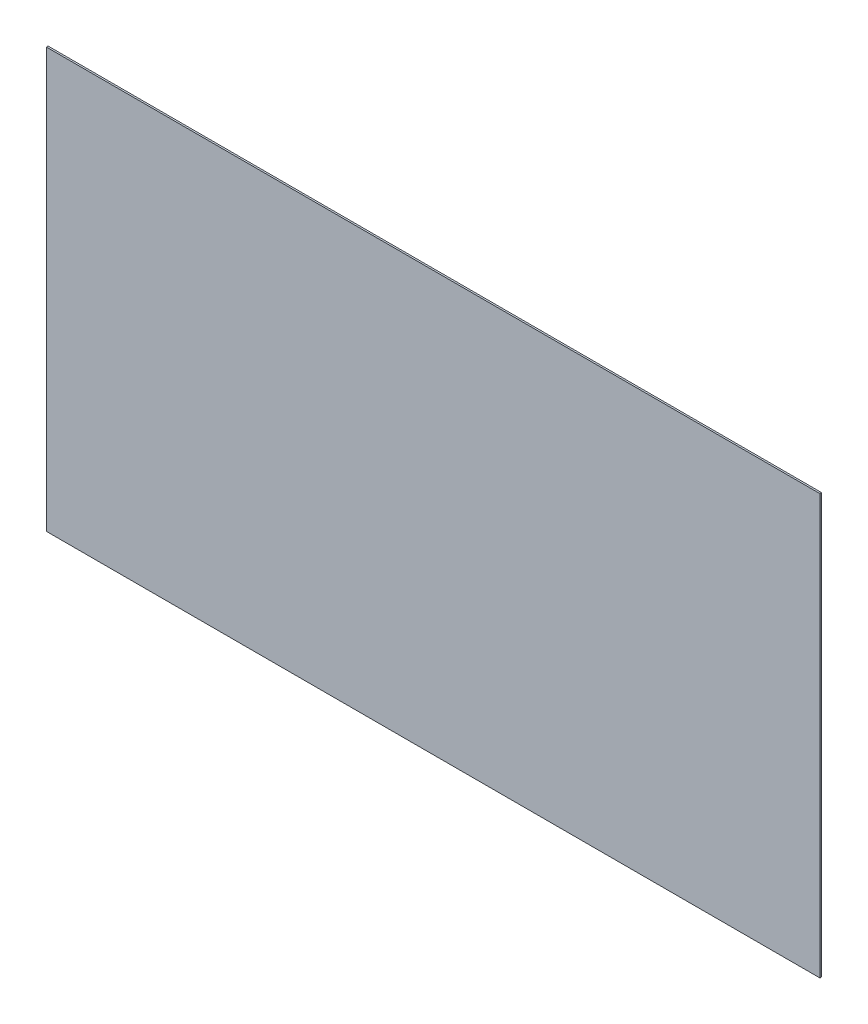
ISO-10303-21;
HEADER;
FILE_DESCRIPTION(('STEP AP214'),'2;1');
FILE_NAME('part.step','',(''),(''),'','','');
FILE_SCHEMA(('AUTOMOTIVE_DESIGN { 1 0 10303 214 1 1 1 1 }'));
ENDSEC;
DATA;
#1=APPLICATION_CONTEXT('core data for automotive mechanical design processes');
#2=APPLICATION_PROTOCOL_DEFINITION('international standard','automotive_design',2000,#1);
#3=PRODUCT_CONTEXT('',#1,'mechanical');
#4=PRODUCT('Part','Part','',(#3));
#5=PRODUCT_RELATED_PRODUCT_CATEGORY('part','',(#4));
#6=PRODUCT_DEFINITION_FORMATION('','',#4);
#7=PRODUCT_DEFINITION_CONTEXT('part definition',#1,'design');
#8=PRODUCT_DEFINITION('design','',#6,#7);
#9=PRODUCT_DEFINITION_SHAPE('','',#8);
#10=(LENGTH_UNIT() NAMED_UNIT(*) SI_UNIT(.MILLI.,.METRE.));
#11=(NAMED_UNIT(*) PLANE_ANGLE_UNIT() SI_UNIT($,.RADIAN.));
#12=(NAMED_UNIT(*) SI_UNIT($,.STERADIAN.) SOLID_ANGLE_UNIT());
#13=UNCERTAINTY_MEASURE_WITH_UNIT(LENGTH_MEASURE(1.E-05),#10,'distance_accuracy_value','');
#14=(GEOMETRIC_REPRESENTATION_CONTEXT(3) GLOBAL_UNCERTAINTY_ASSIGNED_CONTEXT((#13)) GLOBAL_UNIT_ASSIGNED_CONTEXT((#10,
#11,#12)) REPRESENTATION_CONTEXT('',''));
#15=CARTESIAN_POINT('',(0.,0.,0.));
#16=DIRECTION('',(0.,0.,1.));
#17=DIRECTION('',(1.,0.,0.));
#18=AXIS2_PLACEMENT_3D('',#15,#16,#17);
#19=CARTESIAN_POINT('',(225.,122.,1.));
#20=DIRECTION('',(-1.,0.,0.));
#21=DIRECTION('',(0.,-1.,0.));
#22=AXIS2_PLACEMENT_3D('',#19,#20,#21);
#23=PLANE('',#22);
#24=DIRECTION('',(0.,1.,0.));
#25=VECTOR('',#24,1.);
#26=CARTESIAN_POINT('',(225.,122.,0.));
#27=LINE('',#26,#25);
#28=CARTESIAN_POINT('',(225.,-122.,0.));
#29=VERTEX_POINT('',#28);
#30=CARTESIAN_POINT('',(225.,122.,0.));
#31=VERTEX_POINT('',#30);
#32=EDGE_CURVE('E113',#29,#31,#27,.T.);
#33=ORIENTED_EDGE('',*,*,#32,.T.);
#34=DIRECTION('',(0.,0.,-1.));
#35=VECTOR('',#34,1.);
#36=CARTESIAN_POINT('',(225.,122.,1.));
#37=LINE('',#36,#35);
#38=CARTESIAN_POINT('',(225.,122.,1.));
#39=VERTEX_POINT('',#38);
#40=EDGE_CURVE('E11',#39,#31,#37,.T.);
#41=ORIENTED_EDGE('',*,*,#40,.F.);
#42=DIRECTION('',(0.,1.,0.));
#43=VECTOR('',#42,1.);
#44=CARTESIAN_POINT('',(225.,122.,1.));
#45=LINE('',#44,#43);
#46=CARTESIAN_POINT('',(225.,-122.,1.));
#47=VERTEX_POINT('',#46);
#48=EDGE_CURVE('E97',#47,#39,#45,.T.);
#49=ORIENTED_EDGE('',*,*,#48,.F.);
#50=DIRECTION('',(0.,0.,-1.));
#51=VECTOR('',#50,1.);
#52=CARTESIAN_POINT('',(225.,-122.,1.));
#53=LINE('',#52,#51);
#54=EDGE_CURVE('E109',#47,#29,#53,.T.);
#55=ORIENTED_EDGE('',*,*,#54,.T.);
#56=EDGE_LOOP('',(#33,#41,#49,#55));
#57=FACE_BOUND('',#56,.T.);
#58=ADVANCED_FACE('F45',(#57),#23,.F.);
#59=CARTESIAN_POINT('',(-225.,122.,1.));
#60=DIRECTION('',(0.,-1.,0.));
#61=DIRECTION('',(0.,0.,-1.));
#62=AXIS2_PLACEMENT_3D('',#59,#60,#61);
#63=PLANE('',#62);
#64=DIRECTION('',(-1.,0.,0.));
#65=VECTOR('',#64,1.);
#66=CARTESIAN_POINT('',(-225.,122.,0.));
#67=LINE('',#66,#65);
#68=CARTESIAN_POINT('',(-225.,122.,0.));
#69=VERTEX_POINT('',#68);
#70=EDGE_CURVE('E102',#31,#69,#67,.T.);
#71=ORIENTED_EDGE('',*,*,#70,.T.);
#72=DIRECTION('',(0.,0.,-1.));
#73=VECTOR('',#72,1.);
#74=CARTESIAN_POINT('',(-225.,122.,1.));
#75=LINE('',#74,#73);
#76=CARTESIAN_POINT('',(-225.,122.,1.));
#77=VERTEX_POINT('',#76);
#78=EDGE_CURVE('E54',#77,#69,#75,.T.);
#79=ORIENTED_EDGE('',*,*,#78,.F.);
#80=DIRECTION('',(-1.,0.,0.));
#81=VECTOR('',#80,1.);
#82=CARTESIAN_POINT('',(-225.,122.,1.));
#83=LINE('',#82,#81);
#84=EDGE_CURVE('E92',#39,#77,#83,.T.);
#85=ORIENTED_EDGE('',*,*,#84,.F.);
#86=ORIENTED_EDGE('',*,*,#40,.T.);
#87=EDGE_LOOP('',(#71,#79,#85,#86));
#88=FACE_BOUND('',#87,.T.);
#89=ADVANCED_FACE('F101',(#88),#63,.F.);
#90=CARTESIAN_POINT('',(-225.,122.,1.));
#91=DIRECTION('',(1.,0.,0.));
#92=DIRECTION('',(0.,0.,-1.));
#93=AXIS2_PLACEMENT_3D('',#90,#91,#92);
#94=PLANE('',#93);
#95=DIRECTION('',(0.,-1.,0.));
#96=VECTOR('',#95,1.);
#97=CARTESIAN_POINT('',(-225.,122.,0.));
#98=LINE('',#97,#96);
#99=CARTESIAN_POINT('',(-225.,-122.,0.));
#100=VERTEX_POINT('',#99);
#101=EDGE_CURVE('E79',#69,#100,#98,.T.);
#102=ORIENTED_EDGE('',*,*,#101,.T.);
#103=DIRECTION('',(0.,0.,-1.));
#104=VECTOR('',#103,1.);
#105=CARTESIAN_POINT('',(-225.,-122.,1.));
#106=LINE('',#105,#104);
#107=CARTESIAN_POINT('',(-225.,-122.,1.));
#108=VERTEX_POINT('',#107);
#109=EDGE_CURVE('E104',#108,#100,#106,.T.);
#110=ORIENTED_EDGE('',*,*,#109,.F.);
#111=DIRECTION('',(0.,-1.,0.));
#112=VECTOR('',#111,1.);
#113=CARTESIAN_POINT('',(-225.,122.,1.));
#114=LINE('',#113,#112);
#115=EDGE_CURVE('E95',#77,#108,#114,.T.);
#116=ORIENTED_EDGE('',*,*,#115,.F.);
#117=ORIENTED_EDGE('',*,*,#78,.T.);
#118=EDGE_LOOP('',(#102,#110,#116,#117));
#119=FACE_BOUND('',#118,.T.);
#120=ADVANCED_FACE('F105',(#119),#94,.F.);
#121=CARTESIAN_POINT('',(-225.,-122.,1.));
#122=DIRECTION('',(0.,1.,0.));
#123=DIRECTION('',(0.,0.,1.));
#124=AXIS2_PLACEMENT_3D('',#121,#122,#123);
#125=PLANE('',#124);
#126=DIRECTION('',(1.,0.,0.));
#127=VECTOR('',#126,1.);
#128=CARTESIAN_POINT('',(-225.,-122.,0.));
#129=LINE('',#128,#127);
#130=EDGE_CURVE('E85',#100,#29,#129,.T.);
#131=ORIENTED_EDGE('',*,*,#130,.T.);
#132=ORIENTED_EDGE('',*,*,#54,.F.);
#133=DIRECTION('',(1.,0.,0.));
#134=VECTOR('',#133,1.);
#135=CARTESIAN_POINT('',(-225.,-122.,1.));
#136=LINE('',#135,#134);
#137=EDGE_CURVE('E62',#108,#47,#136,.T.);
#138=ORIENTED_EDGE('',*,*,#137,.F.);
#139=ORIENTED_EDGE('',*,*,#109,.T.);
#140=EDGE_LOOP('',(#131,#132,#138,#139));
#141=FACE_BOUND('',#140,.T.);
#142=ADVANCED_FACE('F126',(#141),#125,.F.);
#143=CARTESIAN_POINT('',(0.,0.,1.));
#144=DIRECTION('',(0.,0.,1.));
#145=DIRECTION('',(1.,0.,0.));
#146=AXIS2_PLACEMENT_3D('',#143,#144,#145);
#147=PLANE('',#146);
#148=ORIENTED_EDGE('',*,*,#48,.T.);
#149=ORIENTED_EDGE('',*,*,#84,.T.);
#150=ORIENTED_EDGE('',*,*,#115,.T.);
#151=ORIENTED_EDGE('',*,*,#137,.T.);
#152=EDGE_LOOP('',(#148,#149,#150,#151));
#153=FACE_BOUND('',#152,.T.);
#154=ADVANCED_FACE('F93',(#153),#147,.T.);
#155=CARTESIAN_POINT('',(0.,0.,0.));
#156=DIRECTION('',(0.,0.,1.));
#157=DIRECTION('',(1.,0.,0.));
#158=AXIS2_PLACEMENT_3D('',#155,#156,#157);
#159=PLANE('',#158);
#160=ORIENTED_EDGE('',*,*,#32,.F.);
#161=ORIENTED_EDGE('',*,*,#130,.F.);
#162=ORIENTED_EDGE('',*,*,#101,.F.);
#163=ORIENTED_EDGE('',*,*,#70,.F.);
#164=EDGE_LOOP('',(#160,#161,#162,#163));
#165=FACE_BOUND('',#164,.T.);
#166=ADVANCED_FACE('F129',(#165),#159,.F.);
#167=CLOSED_SHELL('',(#58,#89,#120,#142,#154,#166));
#168=MANIFOLD_SOLID_BREP('B2',#167);
#169=ADVANCED_BREP_SHAPE_REPRESENTATION('',(#18,#168),#14);
#170=SHAPE_DEFINITION_REPRESENTATION(#9,#169);
ENDSEC;
END-ISO-10303-21;
